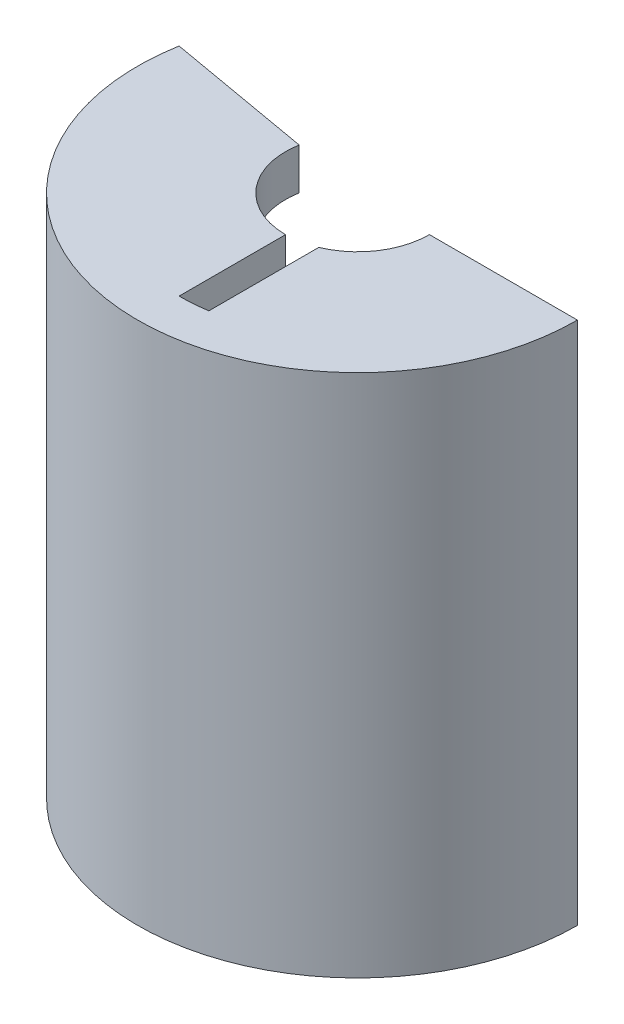
ISO-10303-21;
HEADER;
FILE_DESCRIPTION(('STEP AP214'),'2;1');
FILE_NAME('part.step','',(''),(''),'','','');
FILE_SCHEMA(('AUTOMOTIVE_DESIGN { 1 0 10303 214 1 1 1 1 }'));
ENDSEC;
DATA;
#1=APPLICATION_CONTEXT('core data for automotive mechanical design processes');
#2=APPLICATION_PROTOCOL_DEFINITION('international standard','automotive_design',2000,#1);
#3=PRODUCT_CONTEXT('',#1,'mechanical');
#4=PRODUCT('Part','Part','',(#3));
#5=PRODUCT_RELATED_PRODUCT_CATEGORY('part','',(#4));
#6=PRODUCT_DEFINITION_FORMATION('','',#4);
#7=PRODUCT_DEFINITION_CONTEXT('part definition',#1,'design');
#8=PRODUCT_DEFINITION('design','',#6,#7);
#9=PRODUCT_DEFINITION_SHAPE('','',#8);
#10=(LENGTH_UNIT() NAMED_UNIT(*) SI_UNIT(.MILLI.,.METRE.));
#11=(NAMED_UNIT(*) PLANE_ANGLE_UNIT() SI_UNIT($,.RADIAN.));
#12=(NAMED_UNIT(*) SI_UNIT($,.STERADIAN.) SOLID_ANGLE_UNIT());
#13=UNCERTAINTY_MEASURE_WITH_UNIT(LENGTH_MEASURE(1.E-05),#10,'distance_accuracy_value','');
#14=(GEOMETRIC_REPRESENTATION_CONTEXT(3) GLOBAL_UNCERTAINTY_ASSIGNED_CONTEXT((#13)) GLOBAL_UNIT_ASSIGNED_CONTEXT((#10,
#11,#12)) REPRESENTATION_CONTEXT('',''));
#15=CARTESIAN_POINT('',(0.,0.,0.));
#16=DIRECTION('',(0.,0.,1.));
#17=DIRECTION('',(1.,0.,0.));
#18=AXIS2_PLACEMENT_3D('',#15,#16,#17);
#19=CARTESIAN_POINT('',(0.,104.537715,0.));
#20=DIRECTION('',(0.,1.,0.));
#21=DIRECTION('',(0.,0.,1.));
#22=AXIS2_PLACEMENT_3D('',#19,#20,#21);
#23=CYLINDRICAL_SURFACE('',#22,5.20000000000001);
#24=CARTESIAN_POINT('',(0.,99.6429666666666,0.));
#25=DIRECTION('',(0.,1.,0.));
#26=DIRECTION('',(0.,0.,1.));
#27=AXIS2_PLACEMENT_3D('',#24,#25,#26);
#28=CIRCLE('',#27,5.20000000000001);
#29=CARTESIAN_POINT('',(1.99917419268683,99.6429666666666,4.80034400301636));
#30=VERTEX_POINT('',#29);
#31=CARTESIAN_POINT('',(5.20000000000001,99.6429666666666,0.));
#32=VERTEX_POINT('',#31);
#33=EDGE_CURVE('E374',#30,#32,#28,.T.);
#34=ORIENTED_EDGE('',*,*,#33,.F.);
#35=DIRECTION('',(0.,1.,0.));
#36=VECTOR('',#35,1.);
#37=CARTESIAN_POINT('',(1.99917419268683,104.537715,4.80034400301636));
#38=LINE('',#37,#36);
#39=CARTESIAN_POINT('',(1.99917419268683,102.642966666667,4.80034400301636));
#40=VERTEX_POINT('',#39);
#41=EDGE_CURVE('E258',#30,#40,#38,.T.);
#42=ORIENTED_EDGE('',*,*,#41,.T.);
#43=CARTESIAN_POINT('',(0.,102.642966666667,0.));
#44=DIRECTION('',(0.,1.,0.));
#45=DIRECTION('',(0.,0.,1.));
#46=AXIS2_PLACEMENT_3D('',#43,#44,#45);
#47=CIRCLE('',#46,5.20000000000001);
#48=CARTESIAN_POINT('',(5.20000000000001,102.642966666667,0.));
#49=VERTEX_POINT('',#48);
#50=EDGE_CURVE('E378',#40,#49,#47,.T.);
#51=ORIENTED_EDGE('',*,*,#50,.T.);
#52=DIRECTION('',(0.,-1.,0.));
#53=VECTOR('',#52,1.);
#54=CARTESIAN_POINT('',(5.20000000000001,0.,0.));
#55=LINE('',#54,#53);
#56=EDGE_CURVE('E266',#49,#32,#55,.T.);
#57=ORIENTED_EDGE('',*,*,#56,.T.);
#58=EDGE_LOOP('',(#34,#42,#51,#57));
#59=FACE_BOUND('',#58,.T.);
#60=ADVANCED_FACE('F43',(#59),#23,.F.);
#61=CARTESIAN_POINT('',(0.,99.6429666666666,0.));
#62=DIRECTION('',(0.,1.,0.));
#63=DIRECTION('',(0.,0.,1.));
#64=AXIS2_PLACEMENT_3D('',#61,#62,#63);
#65=PLANE('',#64);
#66=CARTESIAN_POINT('',(0.,99.6429666666666,0.));
#67=DIRECTION('',(0.,1.,0.));
#68=DIRECTION('',(0.,0.,1.));
#69=AXIS2_PLACEMENT_3D('',#66,#67,#68);
#70=CIRCLE('',#69,12.8970983676144);
#71=CARTESIAN_POINT('',(1.99917419268683,99.6429666666666,12.7412106509239));
#72=VERTEX_POINT('',#71);
#73=CARTESIAN_POINT('',(12.8970983676144,99.6429666666666,0.));
#74=VERTEX_POINT('',#73);
#75=EDGE_CURVE('E370',#72,#74,#70,.T.);
#76=ORIENTED_EDGE('',*,*,#75,.F.);
#77=DIRECTION('',(0.,0.,-1.));
#78=VECTOR('',#77,1.);
#79=CARTESIAN_POINT('',(1.99917419268683,99.6429666666666,0.));
#80=LINE('',#79,#78);
#81=EDGE_CURVE('E254',#72,#30,#80,.T.);
#82=ORIENTED_EDGE('',*,*,#81,.T.);
#83=ORIENTED_EDGE('',*,*,#33,.T.);
#84=DIRECTION('',(1.,0.,0.));
#85=VECTOR('',#84,1.);
#86=CARTESIAN_POINT('',(0.,99.6429666666666,0.));
#87=LINE('',#86,#85);
#88=EDGE_CURVE('E270',#32,#74,#87,.T.);
#89=ORIENTED_EDGE('',*,*,#88,.T.);
#90=EDGE_LOOP('',(#76,#82,#83,#89));
#91=FACE_BOUND('',#90,.T.);
#92=ADVANCED_FACE('F401',(#91),#65,.F.);
#93=CARTESIAN_POINT('',(0.,77.3999999999999,0.));
#94=DIRECTION('',(0.,-1.,0.));
#95=DIRECTION('',(0.,0.,-1.));
#96=AXIS2_PLACEMENT_3D('',#93,#94,#95);
#97=PLANE('',#96);
#98=CARTESIAN_POINT('',(0.,77.3999999999999,0.));
#99=DIRECTION('',(0.,1.,0.));
#100=DIRECTION('',(0.,0.,1.));
#101=AXIS2_PLACEMENT_3D('',#98,#99,#100);
#102=CIRCLE('',#101,9.72500000000002);
#103=CARTESIAN_POINT('',(1.99917419268683,77.3999999999999,9.5172962309311));
#104=VERTEX_POINT('',#103);
#105=CARTESIAN_POINT('',(9.72500000000002,77.3999999999999,0.));
#106=VERTEX_POINT('',#105);
#107=EDGE_CURVE('E361',#104,#106,#102,.T.);
#108=ORIENTED_EDGE('',*,*,#107,.F.);
#109=DIRECTION('',(0.,0.,1.));
#110=VECTOR('',#109,1.);
#111=CARTESIAN_POINT('',(1.99917419268683,77.3999999999999,0.));
#112=LINE('',#111,#110);
#113=CARTESIAN_POINT('',(1.99917419268683,77.3999999999999,12.7412106509239));
#114=VERTEX_POINT('',#113);
#115=EDGE_CURVE('E251',#104,#114,#112,.T.);
#116=ORIENTED_EDGE('',*,*,#115,.T.);
#117=CARTESIAN_POINT('',(0.,77.3999999999999,0.));
#118=DIRECTION('',(0.,1.,0.));
#119=DIRECTION('',(0.,0.,1.));
#120=AXIS2_PLACEMENT_3D('',#117,#118,#119);
#121=CIRCLE('',#120,12.8970983676144);
#122=CARTESIAN_POINT('',(12.8970983676144,77.3999999999999,0.));
#123=VERTEX_POINT('',#122);
#124=EDGE_CURVE('E185',#114,#123,#121,.T.);
#125=ORIENTED_EDGE('',*,*,#124,.T.);
#126=DIRECTION('',(-1.,0.,0.));
#127=VECTOR('',#126,1.);
#128=CARTESIAN_POINT('',(0.,77.3999999999999,0.));
#129=LINE('',#128,#127);
#130=EDGE_CURVE('E277',#123,#106,#129,.T.);
#131=ORIENTED_EDGE('',*,*,#130,.T.);
#132=EDGE_LOOP('',(#108,#116,#125,#131));
#133=FACE_BOUND('',#132,.T.);
#134=ADVANCED_FACE('F422',(#133),#97,.F.);
#135=CARTESIAN_POINT('',(0.,104.537715,0.));
#136=DIRECTION('',(0.,1.,0.));
#137=DIRECTION('',(0.,0.,1.));
#138=AXIS2_PLACEMENT_3D('',#135,#136,#137);
#139=CYLINDRICAL_SURFACE('',#138,9.72500000000002);
#140=CARTESIAN_POINT('',(0.,67.7479999999999,0.));
#141=DIRECTION('',(0.,1.,0.));
#142=DIRECTION('',(0.,0.,1.));
#143=AXIS2_PLACEMENT_3D('',#140,#141,#142);
#144=CIRCLE('',#143,9.72500000000002);
#145=CARTESIAN_POINT('',(1.99917419268683,67.7479999999999,9.5172962309311));
#146=VERTEX_POINT('',#145);
#147=CARTESIAN_POINT('',(9.72500000000002,67.7479999999999,0.));
#148=VERTEX_POINT('',#147);
#149=EDGE_CURVE('E356',#146,#148,#144,.T.);
#150=ORIENTED_EDGE('',*,*,#149,.F.);
#151=DIRECTION('',(0.,1.,0.));
#152=VECTOR('',#151,1.);
#153=CARTESIAN_POINT('',(1.99917419268683,104.537715,9.5172962309311));
#154=LINE('',#153,#152);
#155=EDGE_CURVE('E247',#146,#104,#154,.T.);
#156=ORIENTED_EDGE('',*,*,#155,.T.);
#157=ORIENTED_EDGE('',*,*,#107,.T.);
#158=DIRECTION('',(0.,-1.,0.));
#159=VECTOR('',#158,1.);
#160=CARTESIAN_POINT('',(9.72500000000003,0.,0.));
#161=LINE('',#160,#159);
#162=EDGE_CURVE('E281',#106,#148,#161,.T.);
#163=ORIENTED_EDGE('',*,*,#162,.T.);
#164=EDGE_LOOP('',(#150,#156,#157,#163));
#165=FACE_BOUND('',#164,.T.);
#166=ADVANCED_FACE('F425',(#165),#139,.F.);
#167=CARTESIAN_POINT('',(0.,67.7479999999999,0.));
#168=DIRECTION('',(0.,-1.,0.));
#169=DIRECTION('',(0.,0.,-1.));
#170=AXIS2_PLACEMENT_3D('',#167,#168,#169);
#171=PLANE('',#170);
#172=CARTESIAN_POINT('',(0.,67.7479999999999,0.));
#173=DIRECTION('',(0.,1.,0.));
#174=DIRECTION('',(0.,0.,1.));
#175=AXIS2_PLACEMENT_3D('',#172,#173,#174);
#176=CIRCLE('',#175,2.70000000000002);
#177=CARTESIAN_POINT('',(1.99917419268683,67.7479999999999,1.81474586300536));
#178=VERTEX_POINT('',#177);
#179=CARTESIAN_POINT('',(2.70000000000002,67.7479999999999,0.));
#180=VERTEX_POINT('',#179);
#181=EDGE_CURVE('E351',#178,#180,#176,.T.);
#182=ORIENTED_EDGE('',*,*,#181,.F.);
#183=DIRECTION('',(0.,0.,1.));
#184=VECTOR('',#183,1.);
#185=CARTESIAN_POINT('',(1.99917419268683,67.7479999999999,0.));
#186=LINE('',#185,#184);
#187=EDGE_CURVE('E243',#178,#146,#186,.T.);
#188=ORIENTED_EDGE('',*,*,#187,.T.);
#189=ORIENTED_EDGE('',*,*,#149,.T.);
#190=DIRECTION('',(-1.,0.,0.));
#191=VECTOR('',#190,1.);
#192=CARTESIAN_POINT('',(0.,67.7479999999999,0.));
#193=LINE('',#192,#191);
#194=EDGE_CURVE('E285',#148,#180,#193,.T.);
#195=ORIENTED_EDGE('',*,*,#194,.T.);
#196=EDGE_LOOP('',(#182,#188,#189,#195));
#197=FACE_BOUND('',#196,.T.);
#198=ADVANCED_FACE('F428',(#197),#171,.F.);
#199=CARTESIAN_POINT('',(0.,104.537715,0.));
#200=DIRECTION('',(0.,1.,0.));
#201=DIRECTION('',(0.,0.,1.));
#202=AXIS2_PLACEMENT_3D('',#199,#200,#201);
#203=CYLINDRICAL_SURFACE('',#202,2.70000000000002);
#204=CARTESIAN_POINT('',(0.,64.7479999999999,0.));
#205=DIRECTION('',(0.,1.,0.));
#206=DIRECTION('',(0.,0.,1.));
#207=AXIS2_PLACEMENT_3D('',#204,#205,#206);
#208=CIRCLE('',#207,2.70000000000002);
#209=CARTESIAN_POINT('',(1.99917419268683,64.7479999999999,1.81474586300536));
#210=VERTEX_POINT('',#209);
#211=CARTESIAN_POINT('',(2.70000000000002,64.7479999999999,0.));
#212=VERTEX_POINT('',#211);
#213=EDGE_CURVE('E347',#210,#212,#208,.T.);
#214=ORIENTED_EDGE('',*,*,#213,.F.);
#215=DIRECTION('',(0.,1.,0.));
#216=VECTOR('',#215,1.);
#217=CARTESIAN_POINT('',(1.99917419268683,104.537715,1.81474586300536));
#218=LINE('',#217,#216);
#219=EDGE_CURVE('E196',#210,#178,#218,.T.);
#220=ORIENTED_EDGE('',*,*,#219,.T.);
#221=ORIENTED_EDGE('',*,*,#181,.T.);
#222=DIRECTION('',(0.,-1.,0.));
#223=VECTOR('',#222,1.);
#224=CARTESIAN_POINT('',(2.70000000000003,0.,0.));
#225=LINE('',#224,#223);
#226=EDGE_CURVE('E289',#180,#212,#225,.T.);
#227=ORIENTED_EDGE('',*,*,#226,.T.);
#228=EDGE_LOOP('',(#214,#220,#221,#227));
#229=FACE_BOUND('',#228,.T.);
#230=ADVANCED_FACE('F431',(#229),#203,.F.);
#231=CARTESIAN_POINT('',(0.,102.642966666667,0.));
#232=DIRECTION('',(0.,-1.,0.));
#233=DIRECTION('',(0.,0.,-1.));
#234=AXIS2_PLACEMENT_3D('',#231,#232,#233);
#235=PLANE('',#234);
#236=ORIENTED_EDGE('',*,*,#50,.F.);
#237=DIRECTION('',(0.,0.,-1.));
#238=VECTOR('',#237,1.);
#239=CARTESIAN_POINT('',(1.99917419268683,102.642966666667,0.));
#240=LINE('',#239,#238);
#241=CARTESIAN_POINT('',(1.99917419268683,102.642966666667,12.7412106509239));
#242=VERTEX_POINT('',#241);
#243=EDGE_CURVE('E204',#242,#40,#240,.T.);
#244=ORIENTED_EDGE('',*,*,#243,.F.);
#245=CARTESIAN_POINT('',(0.,102.642966666667,0.));
#246=DIRECTION('',(0.,1.,0.));
#247=DIRECTION('',(0.,0.,1.));
#248=AXIS2_PLACEMENT_3D('',#245,#246,#247);
#249=CIRCLE('',#248,12.8970983676144);
#250=CARTESIAN_POINT('',(0.,102.642966666667,12.8970983676144));
#251=VERTEX_POINT('',#250);
#252=EDGE_CURVE('E207',#251,#242,#249,.T.);
#253=ORIENTED_EDGE('',*,*,#252,.F.);
#254=DIRECTION('',(0.,0.,1.));
#255=VECTOR('',#254,1.);
#256=CARTESIAN_POINT('',(0.,102.642966666667,0.));
#257=LINE('',#256,#255);
#258=CARTESIAN_POINT('',(0.,102.642966666667,5.20000000000001));
#259=VERTEX_POINT('',#258);
#260=EDGE_CURVE('E210',#259,#251,#257,.T.);
#261=ORIENTED_EDGE('',*,*,#260,.F.);
#262=CARTESIAN_POINT('',(-5.12100031566349,102.642966666667,-0.902970523868077));
#263=VERTEX_POINT('',#262);
#264=EDGE_CURVE('E52',#263,#259,#47,.T.);
#265=ORIENTED_EDGE('',*,*,#264,.F.);
#266=DIRECTION('',(0.984807753012207,0.,0.173648177666937));
#267=VECTOR('',#266,1.);
#268=CARTESIAN_POINT('',(0.,102.642966666667,0.));
#269=LINE('',#268,#267);
#270=CARTESIAN_POINT('',(-15.6555857228244,102.642966666667,-2.76050216172829));
#271=VERTEX_POINT('',#270);
#272=EDGE_CURVE('E301',#271,#263,#269,.T.);
#273=ORIENTED_EDGE('',*,*,#272,.F.);
#274=CARTESIAN_POINT('',(0.,102.642966666667,0.));
#275=DIRECTION('',(0.,1.,0.));
#276=DIRECTION('',(0.,0.,1.));
#277=AXIS2_PLACEMENT_3D('',#274,#275,#276);
#278=CIRCLE('',#277,15.8970983676144);
#279=CARTESIAN_POINT('',(15.8970983676144,102.642966666667,0.));
#280=VERTEX_POINT('',#279);
#281=EDGE_CURVE('E341',#271,#280,#278,.T.);
#282=ORIENTED_EDGE('',*,*,#281,.T.);
#283=DIRECTION('',(-1.,0.,0.));
#284=VECTOR('',#283,1.);
#285=CARTESIAN_POINT('',(0.,102.642966666667,0.));
#286=LINE('',#285,#284);
#287=EDGE_CURVE('E262',#280,#49,#286,.T.);
#288=ORIENTED_EDGE('',*,*,#287,.T.);
#289=EDGE_LOOP('',(#236,#244,#253,#261,#265,#273,#282,#288));
#290=FACE_BOUND('',#289,.T.);
#291=ADVANCED_FACE('F392',(#290),#235,.F.);
#292=ORIENTED_EDGE('',*,*,#264,.T.);
#293=DIRECTION('',(0.,1.,0.));
#294=VECTOR('',#293,1.);
#295=CARTESIAN_POINT('',(0.,104.537715,5.20000000000001));
#296=LINE('',#295,#294);
#297=CARTESIAN_POINT('',(0.,99.6429666666666,5.20000000000001));
#298=VERTEX_POINT('',#297);
#299=EDGE_CURVE('E237',#259,#298,#296,.F.);
#300=ORIENTED_EDGE('',*,*,#299,.T.);
#301=CARTESIAN_POINT('',(-5.12100031566349,99.6429666666666,-0.902970523868077));
#302=VERTEX_POINT('',#301);
#303=EDGE_CURVE('E375',#302,#298,#28,.T.);
#304=ORIENTED_EDGE('',*,*,#303,.F.);
#305=DIRECTION('',(0.,-1.,0.));
#306=VECTOR('',#305,1.);
#307=CARTESIAN_POINT('',(-5.12100031566349,0.,-0.902970523868077));
#308=LINE('',#307,#306);
#309=EDGE_CURVE('E305',#263,#302,#308,.T.);
#310=ORIENTED_EDGE('',*,*,#309,.F.);
#311=EDGE_LOOP('',(#292,#300,#304,#310));
#312=FACE_BOUND('',#311,.T.);
#313=ADVANCED_FACE('F45',(#312),#23,.F.);
#314=ORIENTED_EDGE('',*,*,#303,.T.);
#315=DIRECTION('',(0.,0.,1.));
#316=VECTOR('',#315,1.);
#317=CARTESIAN_POINT('',(0.,99.6429666666666,0.));
#318=LINE('',#317,#316);
#319=CARTESIAN_POINT('',(0.,99.6429666666666,12.8970983676144));
#320=VERTEX_POINT('',#319);
#321=EDGE_CURVE('E234',#298,#320,#318,.T.);
#322=ORIENTED_EDGE('',*,*,#321,.T.);
#323=CARTESIAN_POINT('',(-12.7011624637878,99.6429666666666,-2.23955762872748));
#324=VERTEX_POINT('',#323);
#325=EDGE_CURVE('E371',#324,#320,#70,.T.);
#326=ORIENTED_EDGE('',*,*,#325,.F.);
#327=DIRECTION('',(-0.984807753012207,0.,-0.173648177666937));
#328=VECTOR('',#327,1.);
#329=CARTESIAN_POINT('',(0.,99.6429666666666,0.));
#330=LINE('',#329,#328);
#331=EDGE_CURVE('E309',#302,#324,#330,.T.);
#332=ORIENTED_EDGE('',*,*,#331,.F.);
#333=EDGE_LOOP('',(#314,#322,#326,#332));
#334=FACE_BOUND('',#333,.T.);
#335=ADVANCED_FACE('F461',(#334),#65,.F.);
#336=CARTESIAN_POINT('',(0.,104.537715,0.));
#337=DIRECTION('',(0.,1.,0.));
#338=DIRECTION('',(0.,0.,1.));
#339=AXIS2_PLACEMENT_3D('',#336,#337,#338);
#340=CYLINDRICAL_SURFACE('',#339,12.8970983676144);
#341=ORIENTED_EDGE('',*,*,#325,.T.);
#342=DIRECTION('',(0.,1.,0.));
#343=VECTOR('',#342,1.);
#344=CARTESIAN_POINT('',(0.,64.7479999999999,12.8970983676144));
#345=LINE('',#344,#343);
#346=EDGE_CURVE('E59',#320,#251,#345,.T.);
#347=ORIENTED_EDGE('',*,*,#346,.T.);
#348=ORIENTED_EDGE('',*,*,#252,.T.);
#349=DIRECTION('',(0.,1.,0.));
#350=VECTOR('',#349,1.);
#351=CARTESIAN_POINT('',(1.99917419268683,64.7479999999999,12.7412106509239));
#352=LINE('',#351,#350);
#353=EDGE_CURVE('E190',#72,#242,#352,.T.);
#354=ORIENTED_EDGE('',*,*,#353,.F.);
#355=ORIENTED_EDGE('',*,*,#75,.T.);
#356=DIRECTION('',(0.,-1.,0.));
#357=VECTOR('',#356,1.);
#358=CARTESIAN_POINT('',(12.8970983676144,0.,0.));
#359=LINE('',#358,#357);
#360=EDGE_CURVE('E274',#74,#123,#359,.T.);
#361=ORIENTED_EDGE('',*,*,#360,.T.);
#362=ORIENTED_EDGE('',*,*,#124,.F.);
#363=CARTESIAN_POINT('',(1.99917419268683,64.7479999999999,12.7412106509239));
#364=VERTEX_POINT('',#363);
#365=EDGE_CURVE('E180',#364,#114,#352,.T.);
#366=ORIENTED_EDGE('',*,*,#365,.F.);
#367=CARTESIAN_POINT('',(0.,64.7479999999999,0.));
#368=DIRECTION('',(0.,1.,0.));
#369=DIRECTION('',(0.,0.,1.));
#370=AXIS2_PLACEMENT_3D('',#367,#368,#369);
#371=CIRCLE('',#370,12.8970983676144);
#372=CARTESIAN_POINT('',(0.,64.7479999999999,12.8970983676144));
#373=VERTEX_POINT('',#372);
#374=EDGE_CURVE('E67',#373,#364,#371,.T.);
#375=ORIENTED_EDGE('',*,*,#374,.F.);
#376=CARTESIAN_POINT('',(0.,77.3999999999999,12.8970983676144));
#377=VERTEX_POINT('',#376);
#378=EDGE_CURVE('E216',#373,#377,#345,.T.);
#379=ORIENTED_EDGE('',*,*,#378,.T.);
#380=CARTESIAN_POINT('',(-12.7011624637878,77.3999999999999,-2.23955762872748));
#381=VERTEX_POINT('',#380);
#382=EDGE_CURVE('E366',#381,#377,#121,.T.);
#383=ORIENTED_EDGE('',*,*,#382,.F.);
#384=DIRECTION('',(0.,-1.,0.));
#385=VECTOR('',#384,1.);
#386=CARTESIAN_POINT('',(-12.7011624637878,0.,-2.23955762872748));
#387=LINE('',#386,#385);
#388=EDGE_CURVE('E313',#324,#381,#387,.T.);
#389=ORIENTED_EDGE('',*,*,#388,.F.);
#390=EDGE_LOOP('',(#341,#347,#348,#354,#355,#361,#362,#366,#375,#379,#383,#389));
#391=FACE_BOUND('',#390,.T.);
#392=ADVANCED_FACE('F183',(#391),#340,.F.);
#393=ORIENTED_EDGE('',*,*,#382,.T.);
#394=DIRECTION('',(0.,0.,-1.));
#395=VECTOR('',#394,1.);
#396=CARTESIAN_POINT('',(0.,77.3999999999999,0.));
#397=LINE('',#396,#395);
#398=CARTESIAN_POINT('',(0.,77.3999999999999,9.72500000000002));
#399=VERTEX_POINT('',#398);
#400=EDGE_CURVE('E230',#377,#399,#397,.T.);
#401=ORIENTED_EDGE('',*,*,#400,.T.);
#402=CARTESIAN_POINT('',(-9.57725539804373,77.3999999999999,-1.68872852781097));
#403=VERTEX_POINT('',#402);
#404=EDGE_CURVE('E362',#403,#399,#102,.T.);
#405=ORIENTED_EDGE('',*,*,#404,.F.);
#406=DIRECTION('',(0.984807753012207,0.,0.173648177666937));
#407=VECTOR('',#406,1.);
#408=CARTESIAN_POINT('',(0.,77.3999999999999,0.));
#409=LINE('',#408,#407);
#410=EDGE_CURVE('E317',#381,#403,#409,.T.);
#411=ORIENTED_EDGE('',*,*,#410,.F.);
#412=EDGE_LOOP('',(#393,#401,#405,#411));
#413=FACE_BOUND('',#412,.T.);
#414=ADVANCED_FACE('F452',(#413),#97,.F.);
#415=ORIENTED_EDGE('',*,*,#404,.T.);
#416=DIRECTION('',(0.,1.,0.));
#417=VECTOR('',#416,1.);
#418=CARTESIAN_POINT('',(0.,104.537715,9.72500000000002));
#419=LINE('',#418,#417);
#420=CARTESIAN_POINT('',(0.,67.7479999999999,9.72500000000002));
#421=VERTEX_POINT('',#420);
#422=EDGE_CURVE('E226',#399,#421,#419,.F.);
#423=ORIENTED_EDGE('',*,*,#422,.T.);
#424=CARTESIAN_POINT('',(-9.57725539804373,67.7479999999999,-1.68872852781097));
#425=VERTEX_POINT('',#424);
#426=EDGE_CURVE('E357',#425,#421,#144,.T.);
#427=ORIENTED_EDGE('',*,*,#426,.F.);
#428=DIRECTION('',(0.,-1.,0.));
#429=VECTOR('',#428,1.);
#430=CARTESIAN_POINT('',(-9.57725539804374,0.,-1.68872852781097));
#431=LINE('',#430,#429);
#432=EDGE_CURVE('E321',#403,#425,#431,.T.);
#433=ORIENTED_EDGE('',*,*,#432,.F.);
#434=EDGE_LOOP('',(#415,#423,#427,#433));
#435=FACE_BOUND('',#434,.T.);
#436=ADVANCED_FACE('F449',(#435),#139,.F.);
#437=ORIENTED_EDGE('',*,*,#426,.T.);
#438=DIRECTION('',(0.,0.,-1.));
#439=VECTOR('',#438,1.);
#440=CARTESIAN_POINT('',(0.,67.7479999999999,0.));
#441=LINE('',#440,#439);
#442=CARTESIAN_POINT('',(0.,67.7479999999999,2.70000000000002));
#443=VERTEX_POINT('',#442);
#444=EDGE_CURVE('E222',#421,#443,#441,.T.);
#445=ORIENTED_EDGE('',*,*,#444,.T.);
#446=CARTESIAN_POINT('',(-2.65898093313298,67.7479999999999,-0.468850079700734));
#447=VERTEX_POINT('',#446);
#448=EDGE_CURVE('E352',#447,#443,#176,.T.);
#449=ORIENTED_EDGE('',*,*,#448,.F.);
#450=DIRECTION('',(0.984807753012207,0.,0.173648177666937));
#451=VECTOR('',#450,1.);
#452=CARTESIAN_POINT('',(0.,67.7479999999999,0.));
#453=LINE('',#452,#451);
#454=EDGE_CURVE('E325',#425,#447,#453,.T.);
#455=ORIENTED_EDGE('',*,*,#454,.F.);
#456=EDGE_LOOP('',(#437,#445,#449,#455));
#457=FACE_BOUND('',#456,.T.);
#458=ADVANCED_FACE('F445',(#457),#171,.F.);
#459=ORIENTED_EDGE('',*,*,#448,.T.);
#460=DIRECTION('',(0.,1.,0.));
#461=VECTOR('',#460,1.);
#462=CARTESIAN_POINT('',(0.,104.537715,2.70000000000002));
#463=LINE('',#462,#461);
#464=CARTESIAN_POINT('',(0.,64.7479999999999,2.70000000000002));
#465=VERTEX_POINT('',#464);
#466=EDGE_CURVE('E189',#443,#465,#463,.F.);
#467=ORIENTED_EDGE('',*,*,#466,.T.);
#468=CARTESIAN_POINT('',(-2.65898093313298,64.7479999999999,-0.468850079700734));
#469=VERTEX_POINT('',#468);
#470=EDGE_CURVE('E348',#469,#465,#208,.T.);
#471=ORIENTED_EDGE('',*,*,#470,.F.);
#472=DIRECTION('',(0.,-1.,0.));
#473=VECTOR('',#472,1.);
#474=CARTESIAN_POINT('',(-2.65898093313299,0.,-0.468850079700736));
#475=LINE('',#474,#473);
#476=EDGE_CURVE('E329',#447,#469,#475,.T.);
#477=ORIENTED_EDGE('',*,*,#476,.F.);
#478=EDGE_LOOP('',(#459,#467,#471,#477));
#479=FACE_BOUND('',#478,.T.);
#480=ADVANCED_FACE('F441',(#479),#203,.F.);
#481=CARTESIAN_POINT('',(0.,64.7479999999999,0.));
#482=DIRECTION('',(0.,1.,0.));
#483=DIRECTION('',(0.,0.,1.));
#484=AXIS2_PLACEMENT_3D('',#481,#482,#483);
#485=PLANE('',#484);
#486=ORIENTED_EDGE('',*,*,#374,.T.);
#487=DIRECTION('',(0.,0.,-1.));
#488=VECTOR('',#487,1.);
#489=CARTESIAN_POINT('',(1.99917419268683,64.7479999999999,0.));
#490=LINE('',#489,#488);
#491=EDGE_CURVE('E193',#364,#210,#490,.T.);
#492=ORIENTED_EDGE('',*,*,#491,.T.);
#493=ORIENTED_EDGE('',*,*,#213,.T.);
#494=DIRECTION('',(1.,0.,0.));
#495=VECTOR('',#494,1.);
#496=CARTESIAN_POINT('',(0.,64.7479999999999,0.));
#497=LINE('',#496,#495);
#498=CARTESIAN_POINT('',(15.8970983676144,64.7479999999999,0.));
#499=VERTEX_POINT('',#498);
#500=EDGE_CURVE('E293',#212,#499,#497,.T.);
#501=ORIENTED_EDGE('',*,*,#500,.T.);
#502=CARTESIAN_POINT('',(0.,64.7479999999999,0.));
#503=DIRECTION('',(0.,1.,0.));
#504=DIRECTION('',(0.,0.,1.));
#505=AXIS2_PLACEMENT_3D('',#502,#503,#504);
#506=CIRCLE('',#505,15.8970983676144);
#507=CARTESIAN_POINT('',(-15.6555857228244,64.7479999999999,-2.76050216172829));
#508=VERTEX_POINT('',#507);
#509=EDGE_CURVE('E344',#508,#499,#506,.T.);
#510=ORIENTED_EDGE('',*,*,#509,.F.);
#511=DIRECTION('',(-0.984807753012207,0.,-0.173648177666937));
#512=VECTOR('',#511,1.);
#513=CARTESIAN_POINT('',(0.,64.7479999999999,0.));
#514=LINE('',#513,#512);
#515=EDGE_CURVE('E333',#469,#508,#514,.T.);
#516=ORIENTED_EDGE('',*,*,#515,.F.);
#517=ORIENTED_EDGE('',*,*,#470,.T.);
#518=DIRECTION('',(0.,0.,1.));
#519=VECTOR('',#518,1.);
#520=CARTESIAN_POINT('',(0.,64.7479999999999,0.));
#521=LINE('',#520,#519);
#522=EDGE_CURVE('E11',#465,#373,#521,.T.);
#523=ORIENTED_EDGE('',*,*,#522,.T.);
#524=EDGE_LOOP('',(#486,#492,#493,#501,#510,#516,#517,#523));
#525=FACE_BOUND('',#524,.T.);
#526=ADVANCED_FACE('F201',(#525),#485,.F.);
#527=CARTESIAN_POINT('',(0.,104.537715,0.));
#528=DIRECTION('',(0.,1.,0.));
#529=DIRECTION('',(0.,0.,1.));
#530=AXIS2_PLACEMENT_3D('',#527,#528,#529);
#531=CYLINDRICAL_SURFACE('',#530,15.8970983676144);
#532=DIRECTION('',(0.,1.,0.));
#533=VECTOR('',#532,1.);
#534=CARTESIAN_POINT('',(-15.6555857228244,0.,-2.76050216172829));
#535=LINE('',#534,#533);
#536=EDGE_CURVE('E337',#508,#271,#535,.T.);
#537=ORIENTED_EDGE('',*,*,#536,.F.);
#538=ORIENTED_EDGE('',*,*,#509,.T.);
#539=DIRECTION('',(0.,1.,0.));
#540=VECTOR('',#539,1.);
#541=CARTESIAN_POINT('',(15.8970983676144,0.,0.));
#542=LINE('',#541,#540);
#543=EDGE_CURVE('E297',#499,#280,#542,.T.);
#544=ORIENTED_EDGE('',*,*,#543,.T.);
#545=ORIENTED_EDGE('',*,*,#281,.F.);
#546=EDGE_LOOP('',(#537,#538,#544,#545));
#547=FACE_BOUND('',#546,.T.);
#548=ADVANCED_FACE('F436',(#547),#531,.T.);
#549=CARTESIAN_POINT('',(0.,0.,0.));
#550=DIRECTION('',(0.173648177666937,0.,-0.984807753012207));
#551=DIRECTION('',(-0.984807753012207,0.,-0.173648177666937));
#552=AXIS2_PLACEMENT_3D('',#549,#550,#551);
#553=PLANE('',#552);
#554=ORIENTED_EDGE('',*,*,#272,.T.);
#555=ORIENTED_EDGE('',*,*,#309,.T.);
#556=ORIENTED_EDGE('',*,*,#331,.T.);
#557=ORIENTED_EDGE('',*,*,#388,.T.);
#558=ORIENTED_EDGE('',*,*,#410,.T.);
#559=ORIENTED_EDGE('',*,*,#432,.T.);
#560=ORIENTED_EDGE('',*,*,#454,.T.);
#561=ORIENTED_EDGE('',*,*,#476,.T.);
#562=ORIENTED_EDGE('',*,*,#515,.T.);
#563=ORIENTED_EDGE('',*,*,#536,.T.);
#564=EDGE_LOOP('',(#554,#555,#556,#557,#558,#559,#560,#561,#562,#563));
#565=FACE_BOUND('',#564,.T.);
#566=ADVANCED_FACE('F438',(#565),#553,.T.);
#567=CARTESIAN_POINT('',(0.,0.,0.));
#568=DIRECTION('',(0.,0.,1.));
#569=DIRECTION('',(1.,0.,0.));
#570=AXIS2_PLACEMENT_3D('',#567,#568,#569);
#571=PLANE('',#570);
#572=ORIENTED_EDGE('',*,*,#287,.F.);
#573=ORIENTED_EDGE('',*,*,#543,.F.);
#574=ORIENTED_EDGE('',*,*,#500,.F.);
#575=ORIENTED_EDGE('',*,*,#226,.F.);
#576=ORIENTED_EDGE('',*,*,#194,.F.);
#577=ORIENTED_EDGE('',*,*,#162,.F.);
#578=ORIENTED_EDGE('',*,*,#130,.F.);
#579=ORIENTED_EDGE('',*,*,#360,.F.);
#580=ORIENTED_EDGE('',*,*,#88,.F.);
#581=ORIENTED_EDGE('',*,*,#56,.F.);
#582=EDGE_LOOP('',(#572,#573,#574,#575,#576,#577,#578,#579,#580,#581));
#583=FACE_BOUND('',#582,.T.);
#584=ADVANCED_FACE('F396',(#583),#571,.F.);
#585=CARTESIAN_POINT('',(0.,64.7479999999999,0.));
#586=DIRECTION('',(-1.,0.,0.));
#587=DIRECTION('',(0.,0.,1.));
#588=AXIS2_PLACEMENT_3D('',#585,#586,#587);
#589=PLANE('',#588);
#590=ORIENTED_EDGE('',*,*,#378,.F.);
#591=ORIENTED_EDGE('',*,*,#522,.F.);
#592=ORIENTED_EDGE('',*,*,#466,.F.);
#593=ORIENTED_EDGE('',*,*,#444,.F.);
#594=ORIENTED_EDGE('',*,*,#422,.F.);
#595=ORIENTED_EDGE('',*,*,#400,.F.);
#596=EDGE_LOOP('',(#590,#591,#592,#593,#594,#595));
#597=FACE_BOUND('',#596,.T.);
#598=ADVANCED_FACE('F443',(#597),#589,.F.);
#599=CARTESIAN_POINT('',(1.99917419268683,64.7479999999999,0.));
#600=DIRECTION('',(1.,0.,0.));
#601=DIRECTION('',(0.,0.,-1.));
#602=AXIS2_PLACEMENT_3D('',#599,#600,#601);
#603=PLANE('',#602);
#604=ORIENTED_EDGE('',*,*,#155,.F.);
#605=ORIENTED_EDGE('',*,*,#187,.F.);
#606=ORIENTED_EDGE('',*,*,#219,.F.);
#607=ORIENTED_EDGE('',*,*,#491,.F.);
#608=ORIENTED_EDGE('',*,*,#365,.T.);
#609=ORIENTED_EDGE('',*,*,#115,.F.);
#610=EDGE_LOOP('',(#604,#605,#606,#607,#608,#609));
#611=FACE_BOUND('',#610,.T.);
#612=ADVANCED_FACE('F194',(#611),#603,.F.);
#613=ORIENTED_EDGE('',*,*,#81,.F.);
#614=ORIENTED_EDGE('',*,*,#353,.T.);
#615=ORIENTED_EDGE('',*,*,#243,.T.);
#616=ORIENTED_EDGE('',*,*,#41,.F.);
#617=EDGE_LOOP('',(#613,#614,#615,#616));
#618=FACE_BOUND('',#617,.T.);
#619=ADVANCED_FACE('F417',(#618),#603,.F.);
#620=ORIENTED_EDGE('',*,*,#260,.T.);
#621=ORIENTED_EDGE('',*,*,#346,.F.);
#622=ORIENTED_EDGE('',*,*,#321,.F.);
#623=ORIENTED_EDGE('',*,*,#299,.F.);
#624=EDGE_LOOP('',(#620,#621,#622,#623));
#625=FACE_BOUND('',#624,.T.);
#626=ADVANCED_FACE('F415',(#625),#589,.F.);
#627=CLOSED_SHELL('',(#60,#92,#134,#166,#198,#230,#291,#313,#335,#392,#414,#436,#458,#480,#526,
#548,#566,#584,#598,#612,#619,#626));
#628=MANIFOLD_SOLID_BREP('B2',#627);
#629=ADVANCED_BREP_SHAPE_REPRESENTATION('',(#18,#628),#14);
#630=SHAPE_DEFINITION_REPRESENTATION(#9,#629);
ENDSEC;
END-ISO-10303-21;
